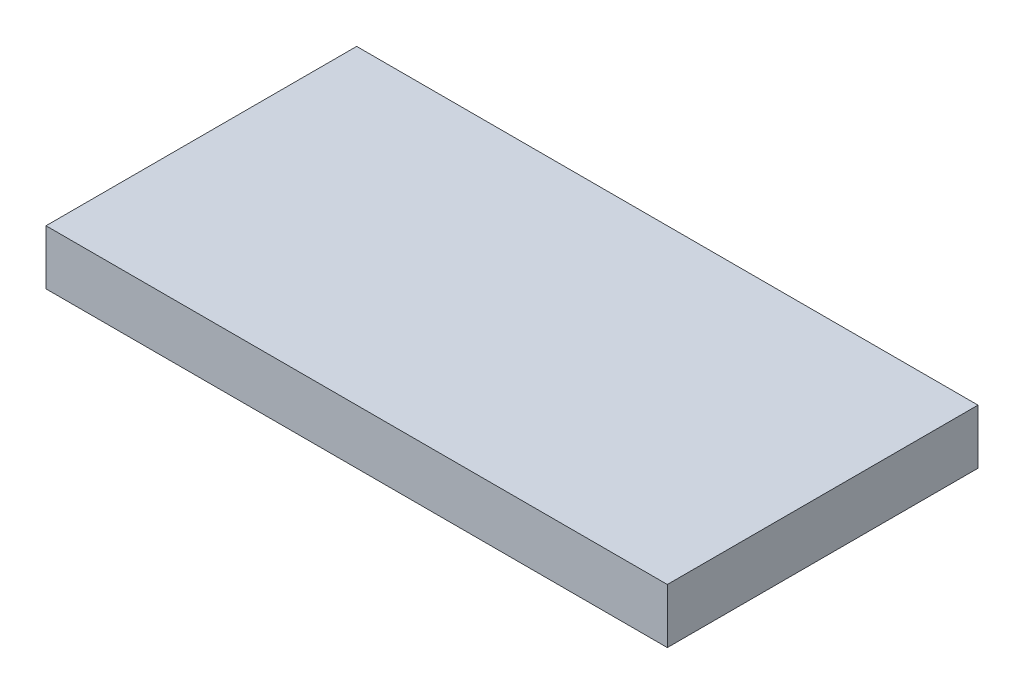
ISO-10303-21;
HEADER;
FILE_DESCRIPTION(('STEP AP214'),'2;1');
FILE_NAME('part.step','',(''),(''),'','','');
FILE_SCHEMA(('AUTOMOTIVE_DESIGN { 1 0 10303 214 1 1 1 1 }'));
ENDSEC;
DATA;
#1=APPLICATION_CONTEXT('core data for automotive mechanical design processes');
#2=APPLICATION_PROTOCOL_DEFINITION('international standard','automotive_design',2000,#1);
#3=PRODUCT_CONTEXT('',#1,'mechanical');
#4=PRODUCT('Part','Part','',(#3));
#5=PRODUCT_RELATED_PRODUCT_CATEGORY('part','',(#4));
#6=PRODUCT_DEFINITION_FORMATION('','',#4);
#7=PRODUCT_DEFINITION_CONTEXT('part definition',#1,'design');
#8=PRODUCT_DEFINITION('design','',#6,#7);
#9=PRODUCT_DEFINITION_SHAPE('','',#8);
#10=(LENGTH_UNIT() NAMED_UNIT(*) SI_UNIT(.MILLI.,.METRE.));
#11=(NAMED_UNIT(*) PLANE_ANGLE_UNIT() SI_UNIT($,.RADIAN.));
#12=(NAMED_UNIT(*) SI_UNIT($,.STERADIAN.) SOLID_ANGLE_UNIT());
#13=UNCERTAINTY_MEASURE_WITH_UNIT(LENGTH_MEASURE(1.E-05),#10,'distance_accuracy_value','');
#14=(GEOMETRIC_REPRESENTATION_CONTEXT(3) GLOBAL_UNCERTAINTY_ASSIGNED_CONTEXT((#13)) GLOBAL_UNIT_ASSIGNED_CONTEXT((#10,
#11,#12)) REPRESENTATION_CONTEXT('',''));
#15=CARTESIAN_POINT('',(0.,0.,0.));
#16=DIRECTION('',(0.,0.,1.));
#17=DIRECTION('',(1.,0.,0.));
#18=AXIS2_PLACEMENT_3D('',#15,#16,#17);
#19=CARTESIAN_POINT('',(0.,2.2,0.));
#20=DIRECTION('',(1.,0.,0.));
#21=DIRECTION('',(0.,0.,-1.));
#22=AXIS2_PLACEMENT_3D('',#19,#20,#21);
#23=PLANE('',#22);
#24=DIRECTION('',(0.,0.,1.));
#25=VECTOR('',#24,1.);
#26=CARTESIAN_POINT('',(0.,0.,0.));
#27=LINE('',#26,#25);
#28=CARTESIAN_POINT('',(0.,0.,0.));
#29=VERTEX_POINT('',#28);
#30=CARTESIAN_POINT('',(0.,0.,12.5));
#31=VERTEX_POINT('',#30);
#32=EDGE_CURVE('E99',#29,#31,#27,.T.);
#33=ORIENTED_EDGE('',*,*,#32,.T.);
#34=DIRECTION('',(0.,-1.,0.));
#35=VECTOR('',#34,1.);
#36=CARTESIAN_POINT('',(0.,2.2,12.5));
#37=LINE('',#36,#35);
#38=CARTESIAN_POINT('',(0.,2.2,12.5));
#39=VERTEX_POINT('',#38);
#40=EDGE_CURVE('E11',#39,#31,#37,.T.);
#41=ORIENTED_EDGE('',*,*,#40,.F.);
#42=DIRECTION('',(0.,0.,1.));
#43=VECTOR('',#42,1.);
#44=CARTESIAN_POINT('',(0.,2.2,0.));
#45=LINE('',#44,#43);
#46=CARTESIAN_POINT('',(0.,2.2,0.));
#47=VERTEX_POINT('',#46);
#48=EDGE_CURVE('E87',#47,#39,#45,.T.);
#49=ORIENTED_EDGE('',*,*,#48,.F.);
#50=DIRECTION('',(0.,-1.,0.));
#51=VECTOR('',#50,1.);
#52=CARTESIAN_POINT('',(0.,2.2,0.));
#53=LINE('',#52,#51);
#54=EDGE_CURVE('E95',#47,#29,#53,.T.);
#55=ORIENTED_EDGE('',*,*,#54,.T.);
#56=EDGE_LOOP('',(#33,#41,#49,#55));
#57=FACE_BOUND('',#56,.T.);
#58=ADVANCED_FACE('F36',(#57),#23,.F.);
#59=CARTESIAN_POINT('',(0.,2.2,12.5));
#60=DIRECTION('',(0.,0.,-1.));
#61=DIRECTION('',(-1.,0.,0.));
#62=AXIS2_PLACEMENT_3D('',#59,#60,#61);
#63=PLANE('',#62);
#64=DIRECTION('',(1.,0.,0.));
#65=VECTOR('',#64,1.);
#66=CARTESIAN_POINT('',(0.,0.,12.5));
#67=LINE('',#66,#65);
#68=CARTESIAN_POINT('',(25.,0.,12.5));
#69=VERTEX_POINT('',#68);
#70=EDGE_CURVE('E91',#31,#69,#67,.T.);
#71=ORIENTED_EDGE('',*,*,#70,.T.);
#72=DIRECTION('',(0.,-1.,0.));
#73=VECTOR('',#72,1.);
#74=CARTESIAN_POINT('',(25.,2.2,12.5));
#75=LINE('',#74,#73);
#76=CARTESIAN_POINT('',(25.,2.2,12.5));
#77=VERTEX_POINT('',#76);
#78=EDGE_CURVE('E44',#77,#69,#75,.T.);
#79=ORIENTED_EDGE('',*,*,#78,.F.);
#80=DIRECTION('',(1.,0.,0.));
#81=VECTOR('',#80,1.);
#82=CARTESIAN_POINT('',(0.,2.2,12.5));
#83=LINE('',#82,#81);
#84=EDGE_CURVE('E82',#39,#77,#83,.T.);
#85=ORIENTED_EDGE('',*,*,#84,.F.);
#86=ORIENTED_EDGE('',*,*,#40,.T.);
#87=EDGE_LOOP('',(#71,#79,#85,#86));
#88=FACE_BOUND('',#87,.T.);
#89=ADVANCED_FACE('F90',(#88),#63,.F.);
#90=CARTESIAN_POINT('',(25.,2.2,0.));
#91=DIRECTION('',(-1.,0.,0.));
#92=DIRECTION('',(0.,0.,1.));
#93=AXIS2_PLACEMENT_3D('',#90,#91,#92);
#94=PLANE('',#93);
#95=DIRECTION('',(0.,0.,-1.));
#96=VECTOR('',#95,1.);
#97=CARTESIAN_POINT('',(25.,0.,0.));
#98=LINE('',#97,#96);
#99=CARTESIAN_POINT('',(25.,0.,0.));
#100=VERTEX_POINT('',#99);
#101=EDGE_CURVE('E69',#69,#100,#98,.T.);
#102=ORIENTED_EDGE('',*,*,#101,.T.);
#103=DIRECTION('',(0.,-1.,0.));
#104=VECTOR('',#103,1.);
#105=CARTESIAN_POINT('',(25.,2.2,0.));
#106=LINE('',#105,#104);
#107=CARTESIAN_POINT('',(25.,2.2,0.));
#108=VERTEX_POINT('',#107);
#109=EDGE_CURVE('E92',#108,#100,#106,.T.);
#110=ORIENTED_EDGE('',*,*,#109,.F.);
#111=DIRECTION('',(0.,0.,-1.));
#112=VECTOR('',#111,1.);
#113=CARTESIAN_POINT('',(25.,2.2,0.));
#114=LINE('',#113,#112);
#115=EDGE_CURVE('E85',#77,#108,#114,.T.);
#116=ORIENTED_EDGE('',*,*,#115,.F.);
#117=ORIENTED_EDGE('',*,*,#78,.T.);
#118=EDGE_LOOP('',(#102,#110,#116,#117));
#119=FACE_BOUND('',#118,.T.);
#120=ADVANCED_FACE('F93',(#119),#94,.F.);
#121=CARTESIAN_POINT('',(0.,2.2,0.));
#122=DIRECTION('',(0.,0.,1.));
#123=DIRECTION('',(1.,0.,0.));
#124=AXIS2_PLACEMENT_3D('',#121,#122,#123);
#125=PLANE('',#124);
#126=DIRECTION('',(-1.,0.,0.));
#127=VECTOR('',#126,1.);
#128=CARTESIAN_POINT('',(0.,0.,0.));
#129=LINE('',#128,#127);
#130=EDGE_CURVE('E75',#100,#29,#129,.T.);
#131=ORIENTED_EDGE('',*,*,#130,.T.);
#132=ORIENTED_EDGE('',*,*,#54,.F.);
#133=DIRECTION('',(-1.,0.,0.));
#134=VECTOR('',#133,1.);
#135=CARTESIAN_POINT('',(0.,2.2,0.));
#136=LINE('',#135,#134);
#137=EDGE_CURVE('E52',#108,#47,#136,.T.);
#138=ORIENTED_EDGE('',*,*,#137,.F.);
#139=ORIENTED_EDGE('',*,*,#109,.T.);
#140=EDGE_LOOP('',(#131,#132,#138,#139));
#141=FACE_BOUND('',#140,.T.);
#142=ADVANCED_FACE('F106',(#141),#125,.F.);
#143=CARTESIAN_POINT('',(0.,2.2,0.));
#144=DIRECTION('',(0.,1.,0.));
#145=DIRECTION('',(0.,0.,1.));
#146=AXIS2_PLACEMENT_3D('',#143,#144,#145);
#147=PLANE('',#146);
#148=ORIENTED_EDGE('',*,*,#48,.T.);
#149=ORIENTED_EDGE('',*,*,#84,.T.);
#150=ORIENTED_EDGE('',*,*,#115,.T.);
#151=ORIENTED_EDGE('',*,*,#137,.T.);
#152=EDGE_LOOP('',(#148,#149,#150,#151));
#153=FACE_BOUND('',#152,.T.);
#154=ADVANCED_FACE('F83',(#153),#147,.T.);
#155=CARTESIAN_POINT('',(0.,0.,0.));
#156=DIRECTION('',(0.,1.,0.));
#157=DIRECTION('',(0.,0.,1.));
#158=AXIS2_PLACEMENT_3D('',#155,#156,#157);
#159=PLANE('',#158);
#160=ORIENTED_EDGE('',*,*,#32,.F.);
#161=ORIENTED_EDGE('',*,*,#130,.F.);
#162=ORIENTED_EDGE('',*,*,#101,.F.);
#163=ORIENTED_EDGE('',*,*,#70,.F.);
#164=EDGE_LOOP('',(#160,#161,#162,#163));
#165=FACE_BOUND('',#164,.T.);
#166=ADVANCED_FACE('F109',(#165),#159,.F.);
#167=CLOSED_SHELL('',(#58,#89,#120,#142,#154,#166));
#168=MANIFOLD_SOLID_BREP('B2',#167);
#169=ADVANCED_BREP_SHAPE_REPRESENTATION('',(#18,#168),#14);
#170=SHAPE_DEFINITION_REPRESENTATION(#9,#169);
ENDSEC;
END-ISO-10303-21;
